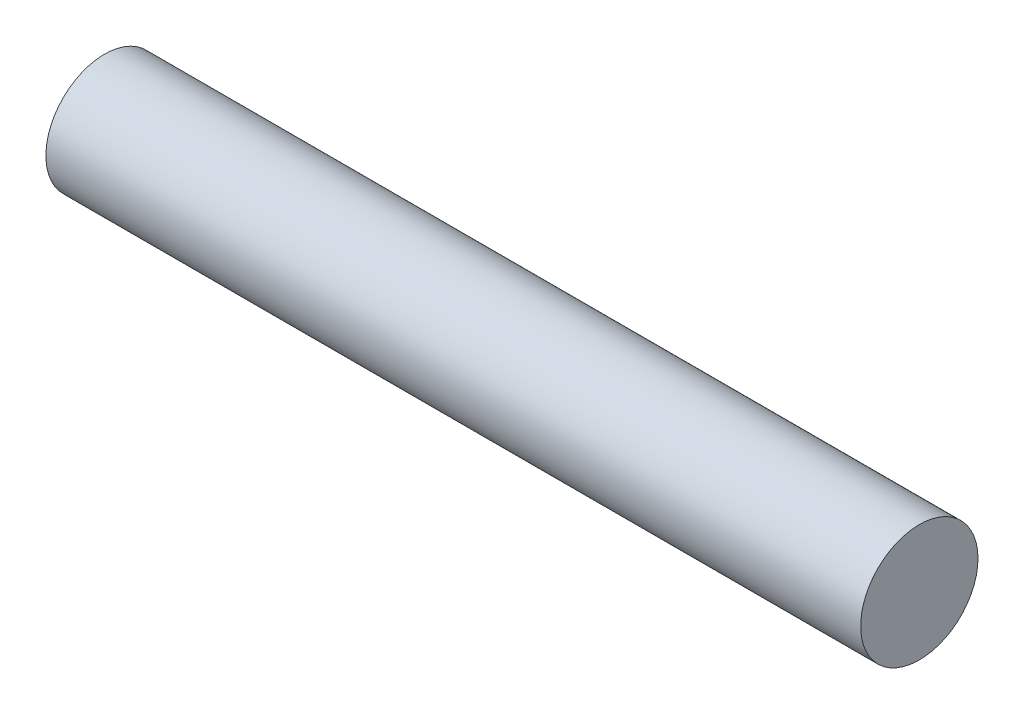
ISO-10303-21;
HEADER;
FILE_DESCRIPTION(('STEP AP214'),'2;1');
FILE_NAME('part.step','',(''),(''),'','','');
FILE_SCHEMA(('AUTOMOTIVE_DESIGN { 1 0 10303 214 1 1 1 1 }'));
ENDSEC;
DATA;
#1=APPLICATION_CONTEXT('core data for automotive mechanical design processes');
#2=APPLICATION_PROTOCOL_DEFINITION('international standard','automotive_design',2000,#1);
#3=PRODUCT_CONTEXT('',#1,'mechanical');
#4=PRODUCT('Part','Part','',(#3));
#5=PRODUCT_RELATED_PRODUCT_CATEGORY('part','',(#4));
#6=PRODUCT_DEFINITION_FORMATION('','',#4);
#7=PRODUCT_DEFINITION_CONTEXT('part definition',#1,'design');
#8=PRODUCT_DEFINITION('design','',#6,#7);
#9=PRODUCT_DEFINITION_SHAPE('','',#8);
#10=(LENGTH_UNIT() NAMED_UNIT(*) SI_UNIT(.MILLI.,.METRE.));
#11=(NAMED_UNIT(*) PLANE_ANGLE_UNIT() SI_UNIT($,.RADIAN.));
#12=(NAMED_UNIT(*) SI_UNIT($,.STERADIAN.) SOLID_ANGLE_UNIT());
#13=UNCERTAINTY_MEASURE_WITH_UNIT(LENGTH_MEASURE(1.E-05),#10,'distance_accuracy_value','');
#14=(GEOMETRIC_REPRESENTATION_CONTEXT(3) GLOBAL_UNCERTAINTY_ASSIGNED_CONTEXT((#13)) GLOBAL_UNIT_ASSIGNED_CONTEXT((#10,
#11,#12)) REPRESENTATION_CONTEXT('',''));
#15=CARTESIAN_POINT('',(0.,0.,0.));
#16=DIRECTION('',(0.,0.,1.));
#17=DIRECTION('',(1.,0.,0.));
#18=AXIS2_PLACEMENT_3D('',#15,#16,#17);
#19=CARTESIAN_POINT('',(25.,0.,0.));
#20=DIRECTION('',(-1.,0.,0.));
#21=DIRECTION('',(0.,0.,1.));
#22=AXIS2_PLACEMENT_3D('',#19,#20,#21);
#23=CYLINDRICAL_SURFACE('',#22,1.8);
#24=CARTESIAN_POINT('',(25.,0.,0.));
#25=DIRECTION('',(1.,0.,0.));
#26=DIRECTION('',(0.,0.,-1.));
#27=AXIS2_PLACEMENT_3D('',#24,#25,#26);
#28=CIRCLE('',#27,1.8);
#29=CARTESIAN_POINT('',(25.,0.,-1.8));
#30=VERTEX_POINT('',#29);
#31=EDGE_CURVE('E10',#30,#30,#28,.T.);
#32=ORIENTED_EDGE('',*,*,#31,.F.);
#33=EDGE_LOOP('',(#32));
#34=FACE_BOUND('',#33,.T.);
#35=CARTESIAN_POINT('',(0.,0.,0.));
#36=DIRECTION('',(1.,0.,0.));
#37=DIRECTION('',(0.,0.,-1.));
#38=AXIS2_PLACEMENT_3D('',#35,#36,#37);
#39=CIRCLE('',#38,1.8);
#40=CARTESIAN_POINT('',(0.,0.,-1.8));
#41=VERTEX_POINT('',#40);
#42=EDGE_CURVE('E40',#41,#41,#39,.T.);
#43=ORIENTED_EDGE('',*,*,#42,.T.);
#44=EDGE_LOOP('',(#43));
#45=FACE_BOUND('',#44,.T.);
#46=ADVANCED_FACE('F37',(#34,#45),#23,.T.);
#47=CARTESIAN_POINT('',(25.,0.,0.));
#48=DIRECTION('',(1.,0.,0.));
#49=DIRECTION('',(0.,0.,-1.));
#50=AXIS2_PLACEMENT_3D('',#47,#48,#49);
#51=PLANE('',#50);
#52=ORIENTED_EDGE('',*,*,#31,.T.);
#53=EDGE_LOOP('',(#52));
#54=FACE_BOUND('',#53,.T.);
#55=ADVANCED_FACE('F52',(#54),#51,.T.);
#56=CARTESIAN_POINT('',(0.,0.,0.));
#57=DIRECTION('',(1.,0.,0.));
#58=DIRECTION('',(0.,0.,-1.));
#59=AXIS2_PLACEMENT_3D('',#56,#57,#58);
#60=PLANE('',#59);
#61=ORIENTED_EDGE('',*,*,#42,.F.);
#62=EDGE_LOOP('',(#61));
#63=FACE_BOUND('',#62,.T.);
#64=ADVANCED_FACE('F50',(#63),#60,.F.);
#65=CLOSED_SHELL('',(#46,#55,#64));
#66=MANIFOLD_SOLID_BREP('B2',#65);
#67=ADVANCED_BREP_SHAPE_REPRESENTATION('',(#18,#66),#14);
#68=SHAPE_DEFINITION_REPRESENTATION(#9,#67);
ENDSEC;
END-ISO-10303-21;
